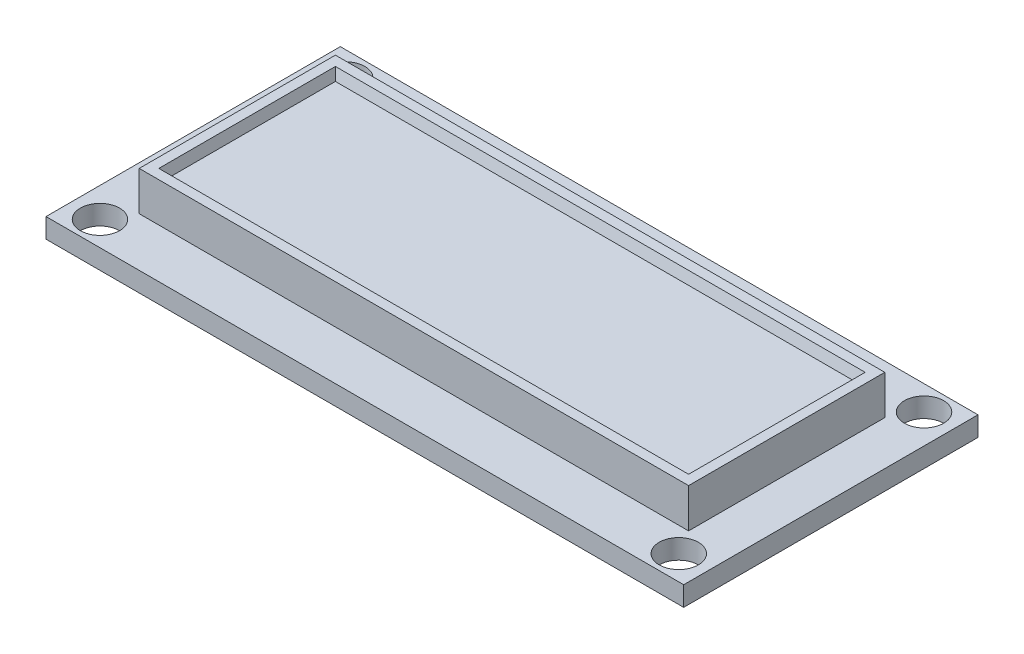
ISO-10303-21;
HEADER;
FILE_DESCRIPTION(('STEP AP214'),'2;1');
FILE_NAME('part.step','',(''),(''),'','','');
FILE_SCHEMA(('AUTOMOTIVE_DESIGN { 1 0 10303 214 1 1 1 1 }'));
ENDSEC;
DATA;
#1=APPLICATION_CONTEXT('core data for automotive mechanical design processes');
#2=APPLICATION_PROTOCOL_DEFINITION('international standard','automotive_design',2000,#1);
#3=PRODUCT_CONTEXT('',#1,'mechanical');
#4=PRODUCT('Part','Part','',(#3));
#5=PRODUCT_RELATED_PRODUCT_CATEGORY('part','',(#4));
#6=PRODUCT_DEFINITION_FORMATION('','',#4);
#7=PRODUCT_DEFINITION_CONTEXT('part definition',#1,'design');
#8=PRODUCT_DEFINITION('design','',#6,#7);
#9=PRODUCT_DEFINITION_SHAPE('','',#8);
#10=(LENGTH_UNIT() NAMED_UNIT(*) SI_UNIT(.MILLI.,.METRE.));
#11=(NAMED_UNIT(*) PLANE_ANGLE_UNIT() SI_UNIT($,.RADIAN.));
#12=(NAMED_UNIT(*) SI_UNIT($,.STERADIAN.) SOLID_ANGLE_UNIT());
#13=UNCERTAINTY_MEASURE_WITH_UNIT(LENGTH_MEASURE(1.E-05),#10,'distance_accuracy_value','');
#14=(GEOMETRIC_REPRESENTATION_CONTEXT(3) GLOBAL_UNCERTAINTY_ASSIGNED_CONTEXT((#13)) GLOBAL_UNIT_ASSIGNED_CONTEXT((#10,
#11,#12)) REPRESENTATION_CONTEXT('',''));
#15=CARTESIAN_POINT('',(0.,0.,0.));
#16=DIRECTION('',(0.,0.,1.));
#17=DIRECTION('',(1.,0.,0.));
#18=AXIS2_PLACEMENT_3D('',#15,#16,#17);
#19=CARTESIAN_POINT('',(0.,2.54,0.));
#20=DIRECTION('',(0.,-1.,0.));
#21=DIRECTION('',(0.,0.,-1.));
#22=AXIS2_PLACEMENT_3D('',#19,#20,#21);
#23=PLANE('',#22);
#24=CARTESIAN_POINT('',(37.465,2.54,-15.875));
#25=DIRECTION('',(0.,1.,0.));
#26=DIRECTION('',(0.,0.,1.));
#27=AXIS2_PLACEMENT_3D('',#24,#25,#26);
#28=CIRCLE('',#27,2.54);
#29=CARTESIAN_POINT('',(37.465,2.54,-13.335));
#30=VERTEX_POINT('',#29);
#31=EDGE_CURVE('E472',#30,#30,#28,.T.);
#32=ORIENTED_EDGE('',*,*,#31,.F.);
#33=EDGE_LOOP('',(#32));
#34=FACE_BOUND('',#33,.T.);
#35=CARTESIAN_POINT('',(37.465,2.54,15.875));
#36=DIRECTION('',(0.,1.,0.));
#37=DIRECTION('',(0.,0.,1.));
#38=AXIS2_PLACEMENT_3D('',#35,#36,#37);
#39=CIRCLE('',#38,2.54);
#40=CARTESIAN_POINT('',(37.465,2.54,18.415));
#41=VERTEX_POINT('',#40);
#42=EDGE_CURVE('E476',#41,#41,#39,.T.);
#43=ORIENTED_EDGE('',*,*,#42,.F.);
#44=EDGE_LOOP('',(#43));
#45=FACE_BOUND('',#44,.T.);
#46=CARTESIAN_POINT('',(-37.465,2.54,15.875));
#47=DIRECTION('',(0.,1.,0.));
#48=DIRECTION('',(0.,0.,1.));
#49=AXIS2_PLACEMENT_3D('',#46,#47,#48);
#50=CIRCLE('',#49,2.54);
#51=CARTESIAN_POINT('',(-37.465,2.54,18.415));
#52=VERTEX_POINT('',#51);
#53=EDGE_CURVE('E486',#52,#52,#50,.T.);
#54=ORIENTED_EDGE('',*,*,#53,.F.);
#55=EDGE_LOOP('',(#54));
#56=FACE_BOUND('',#55,.T.);
#57=CARTESIAN_POINT('',(-37.465,2.54,-15.875));
#58=DIRECTION('',(0.,1.,0.));
#59=DIRECTION('',(0.,0.,1.));
#60=AXIS2_PLACEMENT_3D('',#57,#58,#59);
#61=CIRCLE('',#60,2.54);
#62=CARTESIAN_POINT('',(-37.465,2.54,-13.335));
#63=VERTEX_POINT('',#62);
#64=EDGE_CURVE('E484',#63,#63,#61,.T.);
#65=ORIENTED_EDGE('',*,*,#64,.F.);
#66=EDGE_LOOP('',(#65));
#67=FACE_BOUND('',#66,.T.);
#68=DIRECTION('',(-1.,0.,0.));
#69=VECTOR('',#68,1.);
#70=CARTESIAN_POINT('',(41.275,2.54,-19.05));
#71=LINE('',#70,#69);
#72=CARTESIAN_POINT('',(41.275,2.54,-19.05));
#73=VERTEX_POINT('',#72);
#74=CARTESIAN_POINT('',(-41.275,2.54,-19.05));
#75=VERTEX_POINT('',#74);
#76=EDGE_CURVE('E198',#73,#75,#71,.T.);
#77=ORIENTED_EDGE('',*,*,#76,.T.);
#78=DIRECTION('',(0.,0.,-1.));
#79=VECTOR('',#78,1.);
#80=CARTESIAN_POINT('',(-41.275,2.54,19.05));
#81=LINE('',#80,#79);
#82=CARTESIAN_POINT('',(-41.275,2.54,19.05));
#83=VERTEX_POINT('',#82);
#84=EDGE_CURVE('E200',#83,#75,#81,.T.);
#85=ORIENTED_EDGE('',*,*,#84,.F.);
#86=DIRECTION('',(-1.,0.,0.));
#87=VECTOR('',#86,1.);
#88=CARTESIAN_POINT('',(41.275,2.54,19.05));
#89=LINE('',#88,#87);
#90=CARTESIAN_POINT('',(41.275,2.54,19.05));
#91=VERTEX_POINT('',#90);
#92=EDGE_CURVE('E204',#91,#83,#89,.T.);
#93=ORIENTED_EDGE('',*,*,#92,.F.);
#94=DIRECTION('',(0.,0.,-1.));
#95=VECTOR('',#94,1.);
#96=CARTESIAN_POINT('',(41.275,2.54,19.05));
#97=LINE('',#96,#95);
#98=EDGE_CURVE('E207',#91,#73,#97,.T.);
#99=ORIENTED_EDGE('',*,*,#98,.T.);
#100=EDGE_LOOP('',(#77,#85,#93,#99));
#101=FACE_BOUND('',#100,.T.);
#102=DIRECTION('',(0.,0.,1.));
#103=VECTOR('',#102,1.);
#104=CARTESIAN_POINT('',(-35.56,2.54,12.7));
#105=LINE('',#104,#103);
#106=CARTESIAN_POINT('',(-35.56,2.54,-12.7));
#107=VERTEX_POINT('',#106);
#108=CARTESIAN_POINT('',(-35.56,2.54,12.7));
#109=VERTEX_POINT('',#108);
#110=EDGE_CURVE('E62',#107,#109,#105,.T.);
#111=ORIENTED_EDGE('',*,*,#110,.F.);
#112=DIRECTION('',(-1.,0.,0.));
#113=VECTOR('',#112,1.);
#114=CARTESIAN_POINT('',(35.56,2.54,-12.7));
#115=LINE('',#114,#113);
#116=CARTESIAN_POINT('',(35.56,2.54,-12.7));
#117=VERTEX_POINT('',#116);
#118=EDGE_CURVE('E171',#117,#107,#115,.T.);
#119=ORIENTED_EDGE('',*,*,#118,.F.);
#120=DIRECTION('',(0.,0.,-1.));
#121=VECTOR('',#120,1.);
#122=CARTESIAN_POINT('',(35.56,2.54,12.7));
#123=LINE('',#122,#121);
#124=CARTESIAN_POINT('',(35.56,2.54,12.7));
#125=VERTEX_POINT('',#124);
#126=EDGE_CURVE('E182',#125,#117,#123,.T.);
#127=ORIENTED_EDGE('',*,*,#126,.F.);
#128=DIRECTION('',(1.,0.,0.));
#129=VECTOR('',#128,1.);
#130=CARTESIAN_POINT('',(35.56,2.54,12.7));
#131=LINE('',#130,#129);
#132=EDGE_CURVE('E179',#109,#125,#131,.T.);
#133=ORIENTED_EDGE('',*,*,#132,.F.);
#134=EDGE_LOOP('',(#111,#119,#127,#133));
#135=FACE_BOUND('',#134,.T.);
#136=ADVANCED_FACE('F39',(#34,#45,#56,#67,#101,#135),#23,.F.);
#137=CARTESIAN_POINT('',(41.275,2.54,-19.05));
#138=DIRECTION('',(0.,0.,1.));
#139=DIRECTION('',(1.,0.,0.));
#140=AXIS2_PLACEMENT_3D('',#137,#138,#139);
#141=PLANE('',#140);
#142=DIRECTION('',(-1.,0.,0.));
#143=VECTOR('',#142,1.);
#144=CARTESIAN_POINT('',(41.275,0.,-19.05));
#145=LINE('',#144,#143);
#146=CARTESIAN_POINT('',(41.275,0.,-19.05));
#147=VERTEX_POINT('',#146);
#148=CARTESIAN_POINT('',(-41.275,0.,-19.05));
#149=VERTEX_POINT('',#148);
#150=EDGE_CURVE('E197',#147,#149,#145,.T.);
#151=ORIENTED_EDGE('',*,*,#150,.T.);
#152=DIRECTION('',(0.,-1.,0.));
#153=VECTOR('',#152,1.);
#154=CARTESIAN_POINT('',(-41.275,2.54,-19.05));
#155=LINE('',#154,#153);
#156=EDGE_CURVE('E11',#75,#149,#155,.T.);
#157=ORIENTED_EDGE('',*,*,#156,.F.);
#158=ORIENTED_EDGE('',*,*,#76,.F.);
#159=DIRECTION('',(0.,-1.,0.));
#160=VECTOR('',#159,1.);
#161=CARTESIAN_POINT('',(41.275,2.54,-19.05));
#162=LINE('',#161,#160);
#163=EDGE_CURVE('E209',#73,#147,#162,.T.);
#164=ORIENTED_EDGE('',*,*,#163,.T.);
#165=EDGE_LOOP('',(#151,#157,#158,#164));
#166=FACE_BOUND('',#165,.T.);
#167=ADVANCED_FACE('F41',(#166),#141,.F.);
#168=CARTESIAN_POINT('',(-41.275,2.54,19.05));
#169=DIRECTION('',(-1.,0.,0.));
#170=DIRECTION('',(0.,0.,1.));
#171=AXIS2_PLACEMENT_3D('',#168,#169,#170);
#172=PLANE('',#171);
#173=DIRECTION('',(0.,0.,-1.));
#174=VECTOR('',#173,1.);
#175=CARTESIAN_POINT('',(-41.275,0.,19.05));
#176=LINE('',#175,#174);
#177=CARTESIAN_POINT('',(-41.275,0.,19.05));
#178=VERTEX_POINT('',#177);
#179=EDGE_CURVE('E212',#178,#149,#176,.T.);
#180=ORIENTED_EDGE('',*,*,#179,.F.);
#181=DIRECTION('',(0.,-1.,0.));
#182=VECTOR('',#181,1.);
#183=CARTESIAN_POINT('',(-41.275,2.54,19.05));
#184=LINE('',#183,#182);
#185=EDGE_CURVE('E47',#83,#178,#184,.T.);
#186=ORIENTED_EDGE('',*,*,#185,.F.);
#187=ORIENTED_EDGE('',*,*,#84,.T.);
#188=ORIENTED_EDGE('',*,*,#156,.T.);
#189=EDGE_LOOP('',(#180,#186,#187,#188));
#190=FACE_BOUND('',#189,.T.);
#191=ADVANCED_FACE('F229',(#190),#172,.T.);
#192=CARTESIAN_POINT('',(41.275,2.54,19.05));
#193=DIRECTION('',(0.,0.,1.));
#194=DIRECTION('',(1.,0.,0.));
#195=AXIS2_PLACEMENT_3D('',#192,#193,#194);
#196=PLANE('',#195);
#197=DIRECTION('',(-1.,0.,0.));
#198=VECTOR('',#197,1.);
#199=CARTESIAN_POINT('',(41.275,0.,19.05));
#200=LINE('',#199,#198);
#201=CARTESIAN_POINT('',(41.275,0.,19.05));
#202=VERTEX_POINT('',#201);
#203=EDGE_CURVE('E215',#202,#178,#200,.T.);
#204=ORIENTED_EDGE('',*,*,#203,.F.);
#205=DIRECTION('',(0.,-1.,0.));
#206=VECTOR('',#205,1.);
#207=CARTESIAN_POINT('',(41.275,2.54,19.05));
#208=LINE('',#207,#206);
#209=EDGE_CURVE('E221',#91,#202,#208,.T.);
#210=ORIENTED_EDGE('',*,*,#209,.F.);
#211=ORIENTED_EDGE('',*,*,#92,.T.);
#212=ORIENTED_EDGE('',*,*,#185,.T.);
#213=EDGE_LOOP('',(#204,#210,#211,#212));
#214=FACE_BOUND('',#213,.T.);
#215=ADVANCED_FACE('F225',(#214),#196,.T.);
#216=CARTESIAN_POINT('',(41.275,2.54,19.05));
#217=DIRECTION('',(-1.,0.,0.));
#218=DIRECTION('',(0.,0.,1.));
#219=AXIS2_PLACEMENT_3D('',#216,#217,#218);
#220=PLANE('',#219);
#221=DIRECTION('',(0.,0.,-1.));
#222=VECTOR('',#221,1.);
#223=CARTESIAN_POINT('',(41.275,0.,19.05));
#224=LINE('',#223,#222);
#225=EDGE_CURVE('E201',#202,#147,#224,.T.);
#226=ORIENTED_EDGE('',*,*,#225,.T.);
#227=ORIENTED_EDGE('',*,*,#163,.F.);
#228=ORIENTED_EDGE('',*,*,#98,.F.);
#229=ORIENTED_EDGE('',*,*,#209,.T.);
#230=EDGE_LOOP('',(#226,#227,#228,#229));
#231=FACE_BOUND('',#230,.T.);
#232=ADVANCED_FACE('F237',(#231),#220,.F.);
#233=CARTESIAN_POINT('',(0.,0.,0.));
#234=DIRECTION('',(0.,-1.,0.));
#235=DIRECTION('',(0.,0.,-1.));
#236=AXIS2_PLACEMENT_3D('',#233,#234,#235);
#237=PLANE('',#236);
#238=CARTESIAN_POINT('',(37.465,0.,-15.875));
#239=DIRECTION('',(0.,1.,0.));
#240=DIRECTION('',(0.,0.,1.));
#241=AXIS2_PLACEMENT_3D('',#238,#239,#240);
#242=CIRCLE('',#241,2.54);
#243=CARTESIAN_POINT('',(37.465,0.,-13.335));
#244=VERTEX_POINT('',#243);
#245=EDGE_CURVE('E470',#244,#244,#242,.T.);
#246=ORIENTED_EDGE('',*,*,#245,.T.);
#247=EDGE_LOOP('',(#246));
#248=FACE_BOUND('',#247,.T.);
#249=CARTESIAN_POINT('',(37.465,0.,15.875));
#250=DIRECTION('',(0.,1.,0.));
#251=DIRECTION('',(0.,0.,1.));
#252=AXIS2_PLACEMENT_3D('',#249,#250,#251);
#253=CIRCLE('',#252,2.54);
#254=CARTESIAN_POINT('',(37.465,0.,18.415));
#255=VERTEX_POINT('',#254);
#256=EDGE_CURVE('E473',#255,#255,#253,.T.);
#257=ORIENTED_EDGE('',*,*,#256,.T.);
#258=EDGE_LOOP('',(#257));
#259=FACE_BOUND('',#258,.T.);
#260=CARTESIAN_POINT('',(-37.465,0.,15.875));
#261=DIRECTION('',(0.,1.,0.));
#262=DIRECTION('',(0.,0.,1.));
#263=AXIS2_PLACEMENT_3D('',#260,#261,#262);
#264=CIRCLE('',#263,2.54);
#265=CARTESIAN_POINT('',(-37.465,0.,18.415));
#266=VERTEX_POINT('',#265);
#267=EDGE_CURVE('E490',#266,#266,#264,.T.);
#268=ORIENTED_EDGE('',*,*,#267,.T.);
#269=EDGE_LOOP('',(#268));
#270=FACE_BOUND('',#269,.T.);
#271=CARTESIAN_POINT('',(-37.465,0.,-15.875));
#272=DIRECTION('',(0.,1.,0.));
#273=DIRECTION('',(0.,0.,1.));
#274=AXIS2_PLACEMENT_3D('',#271,#272,#273);
#275=CIRCLE('',#274,2.54);
#276=CARTESIAN_POINT('',(-37.465,0.,-13.335));
#277=VERTEX_POINT('',#276);
#278=EDGE_CURVE('E481',#277,#277,#275,.T.);
#279=ORIENTED_EDGE('',*,*,#278,.T.);
#280=EDGE_LOOP('',(#279));
#281=FACE_BOUND('',#280,.T.);
#282=ORIENTED_EDGE('',*,*,#150,.F.);
#283=ORIENTED_EDGE('',*,*,#225,.F.);
#284=ORIENTED_EDGE('',*,*,#203,.T.);
#285=ORIENTED_EDGE('',*,*,#179,.T.);
#286=EDGE_LOOP('',(#282,#283,#284,#285));
#287=FACE_BOUND('',#286,.T.);
#288=ADVANCED_FACE('F234',(#248,#259,#270,#281,#287),#237,.T.);
#289=CARTESIAN_POINT('',(-35.56,7.62,12.7));
#290=DIRECTION('',(1.,0.,0.));
#291=DIRECTION('',(0.,0.,-1.));
#292=AXIS2_PLACEMENT_3D('',#289,#290,#291);
#293=PLANE('',#292);
#294=ORIENTED_EDGE('',*,*,#110,.T.);
#295=DIRECTION('',(0.,-1.,0.));
#296=VECTOR('',#295,1.);
#297=CARTESIAN_POINT('',(-35.56,7.62,12.7));
#298=LINE('',#297,#296);
#299=CARTESIAN_POINT('',(-35.56,7.62,12.7));
#300=VERTEX_POINT('',#299);
#301=EDGE_CURVE('E194',#300,#109,#298,.T.);
#302=ORIENTED_EDGE('',*,*,#301,.F.);
#303=DIRECTION('',(0.,0.,1.));
#304=VECTOR('',#303,1.);
#305=CARTESIAN_POINT('',(-35.56,7.62,12.7));
#306=LINE('',#305,#304);
#307=CARTESIAN_POINT('',(-35.56,7.62,-12.7));
#308=VERTEX_POINT('',#307);
#309=EDGE_CURVE('E167',#308,#300,#306,.T.);
#310=ORIENTED_EDGE('',*,*,#309,.F.);
#311=DIRECTION('',(0.,-1.,0.));
#312=VECTOR('',#311,1.);
#313=CARTESIAN_POINT('',(-35.56,7.62,-12.7));
#314=LINE('',#313,#312);
#315=EDGE_CURVE('E177',#308,#107,#314,.T.);
#316=ORIENTED_EDGE('',*,*,#315,.T.);
#317=EDGE_LOOP('',(#294,#302,#310,#316));
#318=FACE_BOUND('',#317,.T.);
#319=ADVANCED_FACE('F252',(#318),#293,.F.);
#320=CARTESIAN_POINT('',(35.56,7.62,12.7));
#321=DIRECTION('',(0.,0.,-1.));
#322=DIRECTION('',(-1.,0.,0.));
#323=AXIS2_PLACEMENT_3D('',#320,#321,#322);
#324=PLANE('',#323);
#325=ORIENTED_EDGE('',*,*,#132,.T.);
#326=DIRECTION('',(0.,-1.,0.));
#327=VECTOR('',#326,1.);
#328=CARTESIAN_POINT('',(35.56,7.62,12.7));
#329=LINE('',#328,#327);
#330=CARTESIAN_POINT('',(35.56,7.62,12.7));
#331=VERTEX_POINT('',#330);
#332=EDGE_CURVE('E191',#331,#125,#329,.T.);
#333=ORIENTED_EDGE('',*,*,#332,.F.);
#334=DIRECTION('',(1.,0.,0.));
#335=VECTOR('',#334,1.);
#336=CARTESIAN_POINT('',(35.56,7.62,12.7));
#337=LINE('',#336,#335);
#338=EDGE_CURVE('E170',#300,#331,#337,.T.);
#339=ORIENTED_EDGE('',*,*,#338,.F.);
#340=ORIENTED_EDGE('',*,*,#301,.T.);
#341=EDGE_LOOP('',(#325,#333,#339,#340));
#342=FACE_BOUND('',#341,.T.);
#343=ADVANCED_FACE('F284',(#342),#324,.F.);
#344=CARTESIAN_POINT('',(35.56,7.62,12.7));
#345=DIRECTION('',(-1.,0.,0.));
#346=DIRECTION('',(0.,0.,1.));
#347=AXIS2_PLACEMENT_3D('',#344,#345,#346);
#348=PLANE('',#347);
#349=ORIENTED_EDGE('',*,*,#126,.T.);
#350=DIRECTION('',(0.,-1.,0.));
#351=VECTOR('',#350,1.);
#352=CARTESIAN_POINT('',(35.56,7.62,-12.7));
#353=LINE('',#352,#351);
#354=CARTESIAN_POINT('',(35.56,7.62,-12.7));
#355=VERTEX_POINT('',#354);
#356=EDGE_CURVE('E188',#355,#117,#353,.T.);
#357=ORIENTED_EDGE('',*,*,#356,.F.);
#358=DIRECTION('',(0.,0.,-1.));
#359=VECTOR('',#358,1.);
#360=CARTESIAN_POINT('',(35.56,7.62,12.7));
#361=LINE('',#360,#359);
#362=EDGE_CURVE('E173',#331,#355,#361,.T.);
#363=ORIENTED_EDGE('',*,*,#362,.F.);
#364=ORIENTED_EDGE('',*,*,#332,.T.);
#365=EDGE_LOOP('',(#349,#357,#363,#364));
#366=FACE_BOUND('',#365,.T.);
#367=ADVANCED_FACE('F291',(#366),#348,.F.);
#368=CARTESIAN_POINT('',(35.56,7.62,-12.7));
#369=DIRECTION('',(0.,0.,1.));
#370=DIRECTION('',(1.,0.,0.));
#371=AXIS2_PLACEMENT_3D('',#368,#369,#370);
#372=PLANE('',#371);
#373=ORIENTED_EDGE('',*,*,#118,.T.);
#374=ORIENTED_EDGE('',*,*,#315,.F.);
#375=DIRECTION('',(-1.,0.,0.));
#376=VECTOR('',#375,1.);
#377=CARTESIAN_POINT('',(35.56,7.62,-12.7));
#378=LINE('',#377,#376);
#379=EDGE_CURVE('E175',#355,#308,#378,.T.);
#380=ORIENTED_EDGE('',*,*,#379,.F.);
#381=ORIENTED_EDGE('',*,*,#356,.T.);
#382=EDGE_LOOP('',(#373,#374,#380,#381));
#383=FACE_BOUND('',#382,.T.);
#384=ADVANCED_FACE('F298',(#383),#372,.F.);
#385=CARTESIAN_POINT('',(0.,7.62,0.));
#386=DIRECTION('',(0.,1.,0.));
#387=DIRECTION('',(0.,0.,1.));
#388=AXIS2_PLACEMENT_3D('',#385,#386,#387);
#389=PLANE('',#388);
#390=DIRECTION('',(-1.,0.,0.));
#391=VECTOR('',#390,1.);
#392=CARTESIAN_POINT('',(34.29,7.62,-11.43));
#393=LINE('',#392,#391);
#394=CARTESIAN_POINT('',(34.29,7.62,-11.43));
#395=VERTEX_POINT('',#394);
#396=CARTESIAN_POINT('',(-34.29,7.62,-11.43));
#397=VERTEX_POINT('',#396);
#398=EDGE_CURVE('E54',#395,#397,#393,.T.);
#399=ORIENTED_EDGE('',*,*,#398,.F.);
#400=DIRECTION('',(0.,0.,-1.));
#401=VECTOR('',#400,1.);
#402=CARTESIAN_POINT('',(34.29,7.62,11.43));
#403=LINE('',#402,#401);
#404=CARTESIAN_POINT('',(34.29,7.62,11.43));
#405=VERTEX_POINT('',#404);
#406=EDGE_CURVE('E149',#405,#395,#403,.T.);
#407=ORIENTED_EDGE('',*,*,#406,.F.);
#408=DIRECTION('',(1.,0.,0.));
#409=VECTOR('',#408,1.);
#410=CARTESIAN_POINT('',(-34.29,7.62,11.43));
#411=LINE('',#410,#409);
#412=CARTESIAN_POINT('',(-34.29,7.62,11.43));
#413=VERTEX_POINT('',#412);
#414=EDGE_CURVE('E131',#413,#405,#411,.T.);
#415=ORIENTED_EDGE('',*,*,#414,.F.);
#416=DIRECTION('',(0.,0.,1.));
#417=VECTOR('',#416,1.);
#418=CARTESIAN_POINT('',(-34.29,7.62,-11.43));
#419=LINE('',#418,#417);
#420=EDGE_CURVE('E142',#397,#413,#419,.T.);
#421=ORIENTED_EDGE('',*,*,#420,.F.);
#422=EDGE_LOOP('',(#399,#407,#415,#421));
#423=FACE_BOUND('',#422,.T.);
#424=ORIENTED_EDGE('',*,*,#309,.T.);
#425=ORIENTED_EDGE('',*,*,#338,.T.);
#426=ORIENTED_EDGE('',*,*,#362,.T.);
#427=ORIENTED_EDGE('',*,*,#379,.T.);
#428=EDGE_LOOP('',(#424,#425,#426,#427));
#429=FACE_BOUND('',#428,.T.);
#430=ADVANCED_FACE('F146',(#423,#429),#389,.T.);
#431=CARTESIAN_POINT('',(34.29,7.62,-11.43));
#432=DIRECTION('',(0.,-0.309016994374948,-0.951056516295154));
#433=DIRECTION('',(0.,0.951056516295154,-0.309016994374948));
#434=AXIS2_PLACEMENT_3D('',#431,#432,#433);
#435=PLANE('',#434);
#436=ORIENTED_EDGE('',*,*,#398,.T.);
#437=DIRECTION('',(-0.295241808844326,0.908660854566026,-0.295241808844326));
#438=VECTOR('',#437,1.);
#439=CARTESIAN_POINT('',(-28.3120373722024,-10.7782771654214,-5.45203737220245));
#440=LINE('',#439,#438);
#441=CARTESIAN_POINT('',(-33.8773519857842,6.35,-11.0173519857842));
#442=VERTEX_POINT('',#441);
#443=EDGE_CURVE('E139',#442,#397,#440,.T.);
#444=ORIENTED_EDGE('',*,*,#443,.F.);
#445=DIRECTION('',(-1.,0.,0.));
#446=VECTOR('',#445,1.);
#447=CARTESIAN_POINT('',(0.,6.35,-11.0173519857842));
#448=LINE('',#447,#446);
#449=CARTESIAN_POINT('',(33.8773519857842,6.35,-11.0173519857842));
#450=VERTEX_POINT('',#449);
#451=EDGE_CURVE('E151',#450,#442,#448,.T.);
#452=ORIENTED_EDGE('',*,*,#451,.F.);
#453=DIRECTION('',(0.295241808844326,0.908660854566026,-0.295241808844326));
#454=VECTOR('',#453,1.);
#455=CARTESIAN_POINT('',(32.2973457907341,1.48724094485952,-9.43734579073416));
#456=LINE('',#455,#454);
#457=EDGE_CURVE('E155',#450,#395,#456,.T.);
#458=ORIENTED_EDGE('',*,*,#457,.T.);
#459=EDGE_LOOP('',(#436,#444,#452,#458));
#460=FACE_BOUND('',#459,.T.);
#461=ADVANCED_FACE('F313',(#460),#435,.F.);
#462=CARTESIAN_POINT('',(34.29,7.62,11.43));
#463=DIRECTION('',(0.951056516295154,-0.309016994374948,0.));
#464=DIRECTION('',(0.309016994374948,0.951056516295154,0.));
#465=AXIS2_PLACEMENT_3D('',#462,#463,#464);
#466=PLANE('',#465);
#467=ORIENTED_EDGE('',*,*,#406,.T.);
#468=ORIENTED_EDGE('',*,*,#457,.F.);
#469=DIRECTION('',(0.,0.,-1.));
#470=VECTOR('',#469,1.);
#471=CARTESIAN_POINT('',(33.8773519857842,6.35,0.));
#472=LINE('',#471,#470);
#473=CARTESIAN_POINT('',(33.8773519857842,6.35,11.0173519857842));
#474=VERTEX_POINT('',#473);
#475=EDGE_CURVE('E157',#474,#450,#472,.T.);
#476=ORIENTED_EDGE('',*,*,#475,.F.);
#477=DIRECTION('',(0.295241808844326,0.908660854566026,0.295241808844326));
#478=VECTOR('',#477,1.);
#479=CARTESIAN_POINT('',(28.3120373722024,-10.7782771654214,5.45203737220245));
#480=LINE('',#479,#478);
#481=EDGE_CURVE('E138',#474,#405,#480,.T.);
#482=ORIENTED_EDGE('',*,*,#481,.T.);
#483=EDGE_LOOP('',(#467,#468,#476,#482));
#484=FACE_BOUND('',#483,.T.);
#485=ADVANCED_FACE('F320',(#484),#466,.F.);
#486=CARTESIAN_POINT('',(-34.29,7.62,11.43));
#487=DIRECTION('',(0.,-0.309016994374948,0.951056516295154));
#488=DIRECTION('',(0.,-0.951056516295154,-0.309016994374948));
#489=AXIS2_PLACEMENT_3D('',#486,#487,#488);
#490=PLANE('',#489);
#491=ORIENTED_EDGE('',*,*,#414,.T.);
#492=ORIENTED_EDGE('',*,*,#481,.F.);
#493=DIRECTION('',(1.,0.,0.));
#494=VECTOR('',#493,1.);
#495=CARTESIAN_POINT('',(0.,6.35,11.0173519857842));
#496=LINE('',#495,#494);
#497=CARTESIAN_POINT('',(-33.8773519857842,6.35,11.0173519857842));
#498=VERTEX_POINT('',#497);
#499=EDGE_CURVE('E134',#498,#474,#496,.T.);
#500=ORIENTED_EDGE('',*,*,#499,.F.);
#501=DIRECTION('',(-0.295241808844326,0.908660854566026,0.295241808844326));
#502=VECTOR('',#501,1.);
#503=CARTESIAN_POINT('',(-32.2973457907341,1.48724094485952,9.43734579073415));
#504=LINE('',#503,#502);
#505=EDGE_CURVE('E127',#498,#413,#504,.T.);
#506=ORIENTED_EDGE('',*,*,#505,.T.);
#507=EDGE_LOOP('',(#491,#492,#500,#506));
#508=FACE_BOUND('',#507,.T.);
#509=ADVANCED_FACE('F129',(#508),#490,.F.);
#510=CARTESIAN_POINT('',(-34.29,7.62,-11.43));
#511=DIRECTION('',(-0.951056516295154,-0.309016994374948,0.));
#512=DIRECTION('',(0.309016994374948,-0.951056516295154,0.));
#513=AXIS2_PLACEMENT_3D('',#510,#511,#512);
#514=PLANE('',#513);
#515=ORIENTED_EDGE('',*,*,#420,.T.);
#516=ORIENTED_EDGE('',*,*,#505,.F.);
#517=DIRECTION('',(0.,0.,1.));
#518=VECTOR('',#517,1.);
#519=CARTESIAN_POINT('',(-33.8773519857842,6.35,0.));
#520=LINE('',#519,#518);
#521=EDGE_CURVE('E162',#442,#498,#520,.T.);
#522=ORIENTED_EDGE('',*,*,#521,.F.);
#523=ORIENTED_EDGE('',*,*,#443,.T.);
#524=EDGE_LOOP('',(#515,#516,#522,#523));
#525=FACE_BOUND('',#524,.T.);
#526=ADVANCED_FACE('F143',(#525),#514,.F.);
#527=CARTESIAN_POINT('',(0.,6.35,0.));
#528=DIRECTION('',(0.,1.,0.));
#529=DIRECTION('',(0.,0.,1.));
#530=AXIS2_PLACEMENT_3D('',#527,#528,#529);
#531=PLANE('',#530);
#532=ORIENTED_EDGE('',*,*,#451,.T.);
#533=ORIENTED_EDGE('',*,*,#521,.T.);
#534=ORIENTED_EDGE('',*,*,#499,.T.);
#535=ORIENTED_EDGE('',*,*,#475,.T.);
#536=EDGE_LOOP('',(#532,#533,#534,#535));
#537=FACE_BOUND('',#536,.T.);
#538=ADVANCED_FACE('F340',(#537),#531,.T.);
#539=CARTESIAN_POINT('',(-37.465,0.,-15.875));
#540=DIRECTION('',(0.,1.,0.));
#541=DIRECTION('',(0.,0.,1.));
#542=AXIS2_PLACEMENT_3D('',#539,#540,#541);
#543=CYLINDRICAL_SURFACE('',#542,2.54);
#544=ORIENTED_EDGE('',*,*,#278,.F.);
#545=EDGE_LOOP('',(#544));
#546=FACE_BOUND('',#545,.T.);
#547=ORIENTED_EDGE('',*,*,#64,.T.);
#548=EDGE_LOOP('',(#547));
#549=FACE_BOUND('',#548,.T.);
#550=ADVANCED_FACE('F348',(#546,#549),#543,.F.);
#551=CARTESIAN_POINT('',(-37.465,0.,15.875));
#552=DIRECTION('',(0.,1.,0.));
#553=DIRECTION('',(0.,0.,1.));
#554=AXIS2_PLACEMENT_3D('',#551,#552,#553);
#555=CYLINDRICAL_SURFACE('',#554,2.54);
#556=ORIENTED_EDGE('',*,*,#267,.F.);
#557=EDGE_LOOP('',(#556));
#558=FACE_BOUND('',#557,.T.);
#559=ORIENTED_EDGE('',*,*,#53,.T.);
#560=EDGE_LOOP('',(#559));
#561=FACE_BOUND('',#560,.T.);
#562=ADVANCED_FACE('F354',(#558,#561),#555,.F.);
#563=CARTESIAN_POINT('',(37.465,0.,15.875));
#564=DIRECTION('',(0.,1.,0.));
#565=DIRECTION('',(0.,0.,1.));
#566=AXIS2_PLACEMENT_3D('',#563,#564,#565);
#567=CYLINDRICAL_SURFACE('',#566,2.54);
#568=ORIENTED_EDGE('',*,*,#256,.F.);
#569=EDGE_LOOP('',(#568));
#570=FACE_BOUND('',#569,.T.);
#571=ORIENTED_EDGE('',*,*,#42,.T.);
#572=EDGE_LOOP('',(#571));
#573=FACE_BOUND('',#572,.T.);
#574=ADVANCED_FACE('F362',(#570,#573),#567,.F.);
#575=CARTESIAN_POINT('',(37.465,0.,-15.875));
#576=DIRECTION('',(0.,1.,0.));
#577=DIRECTION('',(0.,0.,1.));
#578=AXIS2_PLACEMENT_3D('',#575,#576,#577);
#579=CYLINDRICAL_SURFACE('',#578,2.54);
#580=ORIENTED_EDGE('',*,*,#245,.F.);
#581=EDGE_LOOP('',(#580));
#582=FACE_BOUND('',#581,.T.);
#583=ORIENTED_EDGE('',*,*,#31,.T.);
#584=EDGE_LOOP('',(#583));
#585=FACE_BOUND('',#584,.T.);
#586=ADVANCED_FACE('F370',(#582,#585),#579,.F.);
#587=CLOSED_SHELL('',(#136,#167,#191,#215,#232,#288,#319,#343,#367,#384,#430,#461,#485,#509,
#526,#538,#550,#562,#574,#586));
#588=MANIFOLD_SOLID_BREP('B2',#587);
#589=ADVANCED_BREP_SHAPE_REPRESENTATION('',(#18,#588),#14);
#590=SHAPE_DEFINITION_REPRESENTATION(#9,#589);
ENDSEC;
END-ISO-10303-21;
